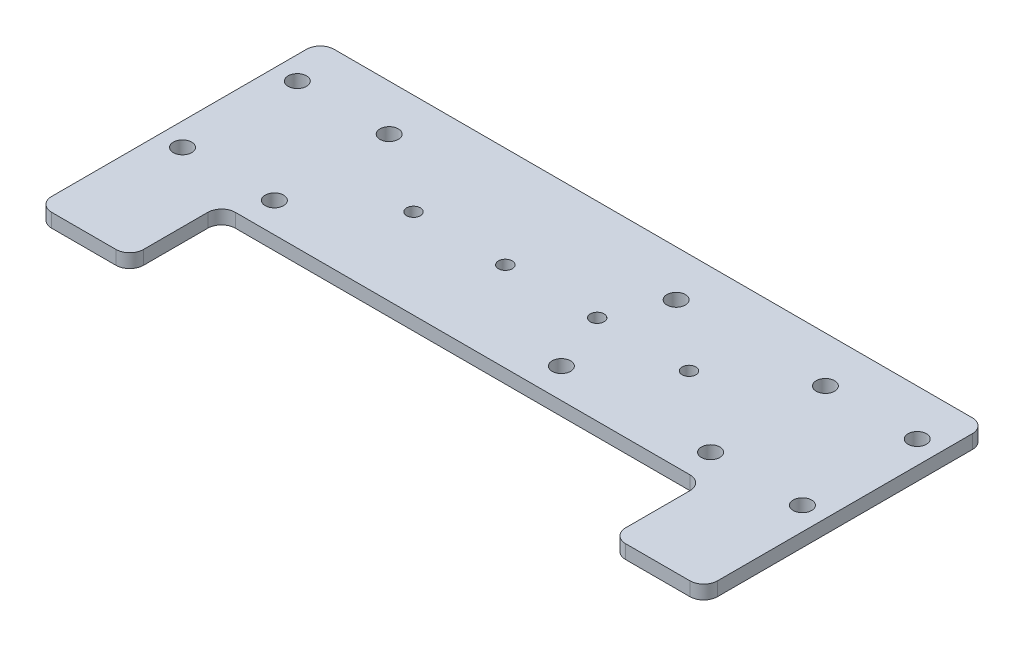
ISO-10303-21;
HEADER;
FILE_DESCRIPTION(('STEP AP214'),'2;1');
FILE_NAME('part.step','',(''),(''),'','','');
FILE_SCHEMA(('AUTOMOTIVE_DESIGN { 1 0 10303 214 1 1 1 1 }'));
ENDSEC;
DATA;
#1=APPLICATION_CONTEXT('core data for automotive mechanical design processes');
#2=APPLICATION_PROTOCOL_DEFINITION('international standard','automotive_design',2000,#1);
#3=PRODUCT_CONTEXT('',#1,'mechanical');
#4=PRODUCT('Part','Part','',(#3));
#5=PRODUCT_RELATED_PRODUCT_CATEGORY('part','',(#4));
#6=PRODUCT_DEFINITION_FORMATION('','',#4);
#7=PRODUCT_DEFINITION_CONTEXT('part definition',#1,'design');
#8=PRODUCT_DEFINITION('design','',#6,#7);
#9=PRODUCT_DEFINITION_SHAPE('','',#8);
#10=(LENGTH_UNIT() NAMED_UNIT(*) SI_UNIT(.MILLI.,.METRE.));
#11=(NAMED_UNIT(*) PLANE_ANGLE_UNIT() SI_UNIT($,.RADIAN.));
#12=(NAMED_UNIT(*) SI_UNIT($,.STERADIAN.) SOLID_ANGLE_UNIT());
#13=UNCERTAINTY_MEASURE_WITH_UNIT(LENGTH_MEASURE(1.E-05),#10,'distance_accuracy_value','');
#14=(GEOMETRIC_REPRESENTATION_CONTEXT(3) GLOBAL_UNCERTAINTY_ASSIGNED_CONTEXT((#13)) GLOBAL_UNIT_ASSIGNED_CONTEXT((#10,
#11,#12)) REPRESENTATION_CONTEXT('',''));
#15=CARTESIAN_POINT('',(0.,0.,0.));
#16=DIRECTION('',(0.,0.,1.));
#17=DIRECTION('',(1.,0.,0.));
#18=AXIS2_PLACEMENT_3D('',#15,#16,#17);
#19=CARTESIAN_POINT('',(72.5,3.,39.));
#20=DIRECTION('',(0.,0.,-1.));
#21=DIRECTION('',(-1.,0.,0.));
#22=AXIS2_PLACEMENT_3D('',#19,#20,#21);
#23=PLANE('',#22);
#24=DIRECTION('',(1.,0.,0.));
#25=VECTOR('',#24,1.);
#26=CARTESIAN_POINT('',(72.5,0.,39.));
#27=LINE('',#26,#25);
#28=CARTESIAN_POINT('',(-69.5,0.,39.));
#29=VERTEX_POINT('',#28);
#30=CARTESIAN_POINT('',(-55.5,0.,39.));
#31=VERTEX_POINT('',#30);
#32=EDGE_CURVE('E168',#29,#31,#27,.T.);
#33=ORIENTED_EDGE('',*,*,#32,.T.);
#34=DIRECTION('',(0.,1.,0.));
#35=VECTOR('',#34,1.);
#36=CARTESIAN_POINT('',(-55.5,3.,39.));
#37=LINE('',#36,#35);
#38=CARTESIAN_POINT('',(-55.5,3.,39.));
#39=VERTEX_POINT('',#38);
#40=EDGE_CURVE('E244',#31,#39,#37,.T.);
#41=ORIENTED_EDGE('',*,*,#40,.T.);
#42=DIRECTION('',(1.,0.,0.));
#43=VECTOR('',#42,1.);
#44=CARTESIAN_POINT('',(72.5,3.,39.));
#45=LINE('',#44,#43);
#46=CARTESIAN_POINT('',(-69.5,3.,39.));
#47=VERTEX_POINT('',#46);
#48=EDGE_CURVE('E169',#47,#39,#45,.T.);
#49=ORIENTED_EDGE('',*,*,#48,.F.);
#50=DIRECTION('',(0.,-1.,0.));
#51=VECTOR('',#50,1.);
#52=CARTESIAN_POINT('',(-69.5,3.,39.));
#53=LINE('',#52,#51);
#54=EDGE_CURVE('E156',#47,#29,#53,.T.);
#55=ORIENTED_EDGE('',*,*,#54,.T.);
#56=EDGE_LOOP('',(#33,#41,#49,#55));
#57=FACE_BOUND('',#56,.T.);
#58=ADVANCED_FACE('F39',(#57),#23,.F.);
#59=CARTESIAN_POINT('',(0.,3.,0.));
#60=DIRECTION('',(0.,1.,0.));
#61=DIRECTION('',(0.,0.,1.));
#62=AXIS2_PLACEMENT_3D('',#59,#60,#61);
#63=PLANE('',#62);
#64=CARTESIAN_POINT('',(-30.2,3.,-0.499999999999987));
#65=DIRECTION('',(0.,1.,0.));
#66=DIRECTION('',(0.,0.,1.));
#67=AXIS2_PLACEMENT_3D('',#64,#65,#66);
#68=CIRCLE('',#67,1.5);
#69=CARTESIAN_POINT('',(-30.2,3.,1.00000000000002));
#70=VERTEX_POINT('',#69);
#71=EDGE_CURVE('E389',#70,#70,#68,.T.);
#72=ORIENTED_EDGE('',*,*,#71,.F.);
#73=EDGE_LOOP('',(#72));
#74=FACE_BOUND('',#73,.T.);
#75=CARTESIAN_POINT('',(-10.2,3.,-0.499999999999987));
#76=DIRECTION('',(0.,1.,0.));
#77=DIRECTION('',(0.,0.,1.));
#78=AXIS2_PLACEMENT_3D('',#75,#76,#77);
#79=CIRCLE('',#78,1.5);
#80=CARTESIAN_POINT('',(-10.2,3.,1.00000000000002));
#81=VERTEX_POINT('',#80);
#82=EDGE_CURVE('E765',#81,#81,#79,.T.);
#83=ORIENTED_EDGE('',*,*,#82,.F.);
#84=EDGE_LOOP('',(#83));
#85=FACE_BOUND('',#84,.T.);
#86=CARTESIAN_POINT('',(9.8,3.,-0.499999999999987));
#87=DIRECTION('',(0.,1.,0.));
#88=DIRECTION('',(0.,0.,1.));
#89=AXIS2_PLACEMENT_3D('',#86,#87,#88);
#90=CIRCLE('',#89,1.5);
#91=CARTESIAN_POINT('',(9.8,3.,1.00000000000002));
#92=VERTEX_POINT('',#91);
#93=EDGE_CURVE('E759',#92,#92,#90,.T.);
#94=ORIENTED_EDGE('',*,*,#93,.F.);
#95=EDGE_LOOP('',(#94));
#96=FACE_BOUND('',#95,.T.);
#97=CARTESIAN_POINT('',(29.8,3.,-0.499999999999987));
#98=DIRECTION('',(0.,1.,0.));
#99=DIRECTION('',(0.,0.,1.));
#100=AXIS2_PLACEMENT_3D('',#97,#98,#99);
#101=CIRCLE('',#100,1.5);
#102=CARTESIAN_POINT('',(29.8,3.,1.00000000000002));
#103=VERTEX_POINT('',#102);
#104=EDGE_CURVE('E755',#103,#103,#101,.T.);
#105=ORIENTED_EDGE('',*,*,#104,.F.);
#106=EDGE_LOOP('',(#105));
#107=FACE_BOUND('',#106,.T.);
#108=DIRECTION('',(0.,0.,-1.));
#109=VECTOR('',#108,1.);
#110=CARTESIAN_POINT('',(52.5,3.,19.));
#111=LINE('',#110,#109);
#112=CARTESIAN_POINT('',(52.5,3.,36.));
#113=VERTEX_POINT('',#112);
#114=CARTESIAN_POINT('',(52.5,3.,22.));
#115=VERTEX_POINT('',#114);
#116=EDGE_CURVE('E263',#113,#115,#111,.T.);
#117=ORIENTED_EDGE('',*,*,#116,.F.);
#118=CARTESIAN_POINT('',(55.5,3.,36.));
#119=DIRECTION('',(0.,1.,0.));
#120=DIRECTION('',(0.,0.,1.));
#121=AXIS2_PLACEMENT_3D('',#118,#119,#120);
#122=CIRCLE('',#121,3.);
#123=CARTESIAN_POINT('',(55.5,3.,39.));
#124=VERTEX_POINT('',#123);
#125=EDGE_CURVE('E237',#113,#124,#122,.T.);
#126=ORIENTED_EDGE('',*,*,#125,.T.);
#127=CARTESIAN_POINT('',(69.5,3.,39.));
#128=VERTEX_POINT('',#127);
#129=EDGE_CURVE('E343',#124,#128,#45,.T.);
#130=ORIENTED_EDGE('',*,*,#129,.T.);
#131=CARTESIAN_POINT('',(69.5,3.,36.));
#132=DIRECTION('',(0.,1.,0.));
#133=DIRECTION('',(0.,0.,1.));
#134=AXIS2_PLACEMENT_3D('',#131,#132,#133);
#135=CIRCLE('',#134,3.);
#136=CARTESIAN_POINT('',(72.5,3.,36.));
#137=VERTEX_POINT('',#136);
#138=EDGE_CURVE('E200',#128,#137,#135,.T.);
#139=ORIENTED_EDGE('',*,*,#138,.T.);
#140=DIRECTION('',(0.,0.,-1.));
#141=VECTOR('',#140,1.);
#142=CARTESIAN_POINT('',(72.5,3.,-22.5));
#143=LINE('',#142,#141);
#144=CARTESIAN_POINT('',(72.5,3.,-19.5));
#145=VERTEX_POINT('',#144);
#146=EDGE_CURVE('E190',#137,#145,#143,.T.);
#147=ORIENTED_EDGE('',*,*,#146,.T.);
#148=CARTESIAN_POINT('',(69.5,3.,-19.5));
#149=DIRECTION('',(0.,1.,0.));
#150=DIRECTION('',(0.,0.,1.));
#151=AXIS2_PLACEMENT_3D('',#148,#149,#150);
#152=CIRCLE('',#151,3.);
#153=CARTESIAN_POINT('',(69.5,3.,-22.5));
#154=VERTEX_POINT('',#153);
#155=EDGE_CURVE('E202',#145,#154,#152,.T.);
#156=ORIENTED_EDGE('',*,*,#155,.T.);
#157=DIRECTION('',(-1.,0.,0.));
#158=VECTOR('',#157,1.);
#159=CARTESIAN_POINT('',(72.5,3.,-22.5));
#160=LINE('',#159,#158);
#161=CARTESIAN_POINT('',(-69.5,3.,-22.5));
#162=VERTEX_POINT('',#161);
#163=EDGE_CURVE('E183',#154,#162,#160,.T.);
#164=ORIENTED_EDGE('',*,*,#163,.T.);
#165=CARTESIAN_POINT('',(-69.5,3.,-19.5));
#166=DIRECTION('',(0.,1.,0.));
#167=DIRECTION('',(0.,0.,1.));
#168=AXIS2_PLACEMENT_3D('',#165,#166,#167);
#169=CIRCLE('',#168,3.);
#170=CARTESIAN_POINT('',(-72.5,3.,-19.5));
#171=VERTEX_POINT('',#170);
#172=EDGE_CURVE('E204',#162,#171,#169,.T.);
#173=ORIENTED_EDGE('',*,*,#172,.T.);
#174=DIRECTION('',(0.,0.,1.));
#175=VECTOR('',#174,1.);
#176=CARTESIAN_POINT('',(-72.5,3.,-22.5));
#177=LINE('',#176,#175);
#178=CARTESIAN_POINT('',(-72.5,3.,36.));
#179=VERTEX_POINT('',#178);
#180=EDGE_CURVE('E340',#171,#179,#177,.T.);
#181=ORIENTED_EDGE('',*,*,#180,.T.);
#182=CARTESIAN_POINT('',(-69.5,3.,36.));
#183=DIRECTION('',(0.,1.,0.));
#184=DIRECTION('',(0.,0.,1.));
#185=AXIS2_PLACEMENT_3D('',#182,#183,#184);
#186=CIRCLE('',#185,3.);
#187=EDGE_CURVE('E206',#179,#47,#186,.T.);
#188=ORIENTED_EDGE('',*,*,#187,.T.);
#189=ORIENTED_EDGE('',*,*,#48,.T.);
#190=CARTESIAN_POINT('',(-55.5,3.,36.));
#191=DIRECTION('',(0.,1.,0.));
#192=DIRECTION('',(0.,0.,1.));
#193=AXIS2_PLACEMENT_3D('',#190,#191,#192);
#194=CIRCLE('',#193,3.);
#195=CARTESIAN_POINT('',(-52.5,3.,36.));
#196=VERTEX_POINT('',#195);
#197=EDGE_CURVE('E54',#39,#196,#194,.T.);
#198=ORIENTED_EDGE('',*,*,#197,.T.);
#199=DIRECTION('',(0.,0.,1.));
#200=VECTOR('',#199,1.);
#201=CARTESIAN_POINT('',(-52.5,3.,39.));
#202=LINE('',#201,#200);
#203=CARTESIAN_POINT('',(-52.5,3.,22.));
#204=VERTEX_POINT('',#203);
#205=EDGE_CURVE('E255',#204,#196,#202,.T.);
#206=ORIENTED_EDGE('',*,*,#205,.F.);
#207=CARTESIAN_POINT('',(-49.5,3.,22.));
#208=DIRECTION('',(0.,1.,0.));
#209=DIRECTION('',(0.,0.,1.));
#210=AXIS2_PLACEMENT_3D('',#207,#208,#209);
#211=CIRCLE('',#210,3.);
#212=CARTESIAN_POINT('',(-49.5,3.,19.));
#213=VERTEX_POINT('',#212);
#214=EDGE_CURVE('E47',#204,#213,#211,.F.);
#215=ORIENTED_EDGE('',*,*,#214,.T.);
#216=DIRECTION('',(-1.,0.,0.));
#217=VECTOR('',#216,1.);
#218=CARTESIAN_POINT('',(-52.5,3.,19.));
#219=LINE('',#218,#217);
#220=CARTESIAN_POINT('',(49.5,3.,19.));
#221=VERTEX_POINT('',#220);
#222=EDGE_CURVE('E254',#221,#213,#219,.T.);
#223=ORIENTED_EDGE('',*,*,#222,.F.);
#224=CARTESIAN_POINT('',(49.5,3.,22.));
#225=DIRECTION('',(0.,1.,0.));
#226=DIRECTION('',(0.,0.,1.));
#227=AXIS2_PLACEMENT_3D('',#224,#225,#226);
#228=CIRCLE('',#227,3.);
#229=EDGE_CURVE('E246',#221,#115,#228,.F.);
#230=ORIENTED_EDGE('',*,*,#229,.T.);
#231=EDGE_LOOP('',(#117,#126,#130,#139,#147,#156,#164,#173,#181,#188,#189,#198,#206,#215,#223,#230));
#232=FACE_BOUND('',#231,.T.);
#233=CARTESIAN_POINT('',(47.5,3.,-12.5));
#234=DIRECTION('',(0.,1.,0.));
#235=DIRECTION('',(0.,0.,1.));
#236=AXIS2_PLACEMENT_3D('',#233,#234,#235);
#237=CIRCLE('',#236,2.);
#238=CARTESIAN_POINT('',(47.5,3.,-10.5));
#239=VERTEX_POINT('',#238);
#240=EDGE_CURVE('E284',#239,#239,#237,.T.);
#241=ORIENTED_EDGE('',*,*,#240,.F.);
#242=EDGE_LOOP('',(#241));
#243=FACE_BOUND('',#242,.T.);
#244=CARTESIAN_POINT('',(-47.5,3.,-12.5));
#245=DIRECTION('',(0.,1.,0.));
#246=DIRECTION('',(0.,0.,1.));
#247=AXIS2_PLACEMENT_3D('',#244,#245,#246);
#248=CIRCLE('',#247,2.);
#249=CARTESIAN_POINT('',(-47.5,3.,-10.5));
#250=VERTEX_POINT('',#249);
#251=EDGE_CURVE('E296',#250,#250,#248,.T.);
#252=ORIENTED_EDGE('',*,*,#251,.F.);
#253=EDGE_LOOP('',(#252));
#254=FACE_BOUND('',#253,.T.);
#255=CARTESIAN_POINT('',(15.,3.,-12.5));
#256=DIRECTION('',(0.,1.,0.));
#257=DIRECTION('',(0.,0.,1.));
#258=AXIS2_PLACEMENT_3D('',#255,#256,#257);
#259=CIRCLE('',#258,2.);
#260=CARTESIAN_POINT('',(15.,3.,-10.5));
#261=VERTEX_POINT('',#260);
#262=EDGE_CURVE('E308',#261,#261,#259,.T.);
#263=ORIENTED_EDGE('',*,*,#262,.F.);
#264=EDGE_LOOP('',(#263));
#265=FACE_BOUND('',#264,.T.);
#266=CARTESIAN_POINT('',(67.5,3.,-12.5));
#267=DIRECTION('',(0.,1.,0.));
#268=DIRECTION('',(0.,0.,1.));
#269=AXIS2_PLACEMENT_3D('',#266,#267,#268);
#270=CIRCLE('',#269,2.);
#271=CARTESIAN_POINT('',(67.5,3.,-10.5));
#272=VERTEX_POINT('',#271);
#273=EDGE_CURVE('E320',#272,#272,#270,.T.);
#274=ORIENTED_EDGE('',*,*,#273,.F.);
#275=EDGE_LOOP('',(#274));
#276=FACE_BOUND('',#275,.T.);
#277=CARTESIAN_POINT('',(-67.5,3.,-12.5));
#278=DIRECTION('',(0.,1.,0.));
#279=DIRECTION('',(0.,0.,1.));
#280=AXIS2_PLACEMENT_3D('',#277,#278,#279);
#281=CIRCLE('',#280,2.);
#282=CARTESIAN_POINT('',(-67.5,3.,-10.5));
#283=VERTEX_POINT('',#282);
#284=EDGE_CURVE('E332',#283,#283,#281,.T.);
#285=ORIENTED_EDGE('',*,*,#284,.F.);
#286=EDGE_LOOP('',(#285));
#287=FACE_BOUND('',#286,.T.);
#288=CARTESIAN_POINT('',(-67.5,3.,12.5));
#289=DIRECTION('',(0.,1.,0.));
#290=DIRECTION('',(0.,0.,1.));
#291=AXIS2_PLACEMENT_3D('',#288,#289,#290);
#292=CIRCLE('',#291,2.);
#293=CARTESIAN_POINT('',(-67.5,3.,14.5));
#294=VERTEX_POINT('',#293);
#295=EDGE_CURVE('E326',#294,#294,#292,.T.);
#296=ORIENTED_EDGE('',*,*,#295,.F.);
#297=EDGE_LOOP('',(#296));
#298=FACE_BOUND('',#297,.T.);
#299=CARTESIAN_POINT('',(67.5,3.,12.5));
#300=DIRECTION('',(0.,1.,0.));
#301=DIRECTION('',(0.,0.,1.));
#302=AXIS2_PLACEMENT_3D('',#299,#300,#301);
#303=CIRCLE('',#302,2.);
#304=CARTESIAN_POINT('',(67.5,3.,14.5));
#305=VERTEX_POINT('',#304);
#306=EDGE_CURVE('E314',#305,#305,#303,.T.);
#307=ORIENTED_EDGE('',*,*,#306,.F.);
#308=EDGE_LOOP('',(#307));
#309=FACE_BOUND('',#308,.T.);
#310=CARTESIAN_POINT('',(15.,3.,12.5));
#311=DIRECTION('',(0.,1.,0.));
#312=DIRECTION('',(0.,0.,1.));
#313=AXIS2_PLACEMENT_3D('',#310,#311,#312);
#314=CIRCLE('',#313,2.);
#315=CARTESIAN_POINT('',(15.,3.,14.5));
#316=VERTEX_POINT('',#315);
#317=EDGE_CURVE('E302',#316,#316,#314,.T.);
#318=ORIENTED_EDGE('',*,*,#317,.F.);
#319=EDGE_LOOP('',(#318));
#320=FACE_BOUND('',#319,.T.);
#321=CARTESIAN_POINT('',(-47.5,3.,12.5));
#322=DIRECTION('',(0.,1.,0.));
#323=DIRECTION('',(0.,0.,1.));
#324=AXIS2_PLACEMENT_3D('',#321,#322,#323);
#325=CIRCLE('',#324,2.);
#326=CARTESIAN_POINT('',(-47.5,3.,14.5));
#327=VERTEX_POINT('',#326);
#328=EDGE_CURVE('E290',#327,#327,#325,.T.);
#329=ORIENTED_EDGE('',*,*,#328,.F.);
#330=EDGE_LOOP('',(#329));
#331=FACE_BOUND('',#330,.T.);
#332=CARTESIAN_POINT('',(47.5,3.,12.5));
#333=DIRECTION('',(0.,1.,0.));
#334=DIRECTION('',(0.,0.,1.));
#335=AXIS2_PLACEMENT_3D('',#332,#333,#334);
#336=CIRCLE('',#335,2.);
#337=CARTESIAN_POINT('',(47.5,3.,14.5));
#338=VERTEX_POINT('',#337);
#339=EDGE_CURVE('E275',#338,#338,#336,.T.);
#340=ORIENTED_EDGE('',*,*,#339,.F.);
#341=EDGE_LOOP('',(#340));
#342=FACE_BOUND('',#341,.T.);
#343=ADVANCED_FACE('F252',(#74,#85,#96,#107,#232,#243,#254,#265,#276,#287,#298,#309,#320,#331,
#342),#63,.T.);
#344=CARTESIAN_POINT('',(0.,0.,0.));
#345=DIRECTION('',(0.,1.,0.));
#346=DIRECTION('',(0.,0.,1.));
#347=AXIS2_PLACEMENT_3D('',#344,#345,#346);
#348=PLANE('',#347);
#349=CARTESIAN_POINT('',(-30.2,0.,-0.499999999999987));
#350=DIRECTION('',(0.,1.,0.));
#351=DIRECTION('',(0.,0.,1.));
#352=AXIS2_PLACEMENT_3D('',#349,#350,#351);
#353=CIRCLE('',#352,1.5);
#354=CARTESIAN_POINT('',(-30.2,0.,1.00000000000002));
#355=VERTEX_POINT('',#354);
#356=EDGE_CURVE('E386',#355,#355,#353,.T.);
#357=ORIENTED_EDGE('',*,*,#356,.T.);
#358=EDGE_LOOP('',(#357));
#359=FACE_BOUND('',#358,.T.);
#360=CARTESIAN_POINT('',(-10.2,0.,-0.499999999999987));
#361=DIRECTION('',(0.,1.,0.));
#362=DIRECTION('',(0.,0.,1.));
#363=AXIS2_PLACEMENT_3D('',#360,#361,#362);
#364=CIRCLE('',#363,1.5);
#365=CARTESIAN_POINT('',(-10.2,0.,1.00000000000002));
#366=VERTEX_POINT('',#365);
#367=EDGE_CURVE('E748',#366,#366,#364,.T.);
#368=ORIENTED_EDGE('',*,*,#367,.T.);
#369=EDGE_LOOP('',(#368));
#370=FACE_BOUND('',#369,.T.);
#371=CARTESIAN_POINT('',(9.8,0.,-0.499999999999987));
#372=DIRECTION('',(0.,1.,0.));
#373=DIRECTION('',(0.,0.,1.));
#374=AXIS2_PLACEMENT_3D('',#371,#372,#373);
#375=CIRCLE('',#374,1.5);
#376=CARTESIAN_POINT('',(9.8,0.,1.00000000000002));
#377=VERTEX_POINT('',#376);
#378=EDGE_CURVE('E752',#377,#377,#375,.T.);
#379=ORIENTED_EDGE('',*,*,#378,.T.);
#380=EDGE_LOOP('',(#379));
#381=FACE_BOUND('',#380,.T.);
#382=CARTESIAN_POINT('',(29.8,0.,-0.499999999999987));
#383=DIRECTION('',(0.,1.,0.));
#384=DIRECTION('',(0.,0.,1.));
#385=AXIS2_PLACEMENT_3D('',#382,#383,#384);
#386=CIRCLE('',#385,1.5);
#387=CARTESIAN_POINT('',(29.8,0.,1.00000000000002));
#388=VERTEX_POINT('',#387);
#389=EDGE_CURVE('E392',#388,#388,#386,.T.);
#390=ORIENTED_EDGE('',*,*,#389,.T.);
#391=EDGE_LOOP('',(#390));
#392=FACE_BOUND('',#391,.T.);
#393=CARTESIAN_POINT('',(55.5,0.,39.));
#394=VERTEX_POINT('',#393);
#395=CARTESIAN_POINT('',(69.5,0.,39.));
#396=VERTEX_POINT('',#395);
#397=EDGE_CURVE('E180',#394,#396,#27,.T.);
#398=ORIENTED_EDGE('',*,*,#397,.F.);
#399=CARTESIAN_POINT('',(55.5,0.,36.));
#400=DIRECTION('',(0.,1.,0.));
#401=DIRECTION('',(0.,0.,1.));
#402=AXIS2_PLACEMENT_3D('',#399,#400,#401);
#403=CIRCLE('',#402,3.);
#404=CARTESIAN_POINT('',(52.5,0.,36.));
#405=VERTEX_POINT('',#404);
#406=EDGE_CURVE('E234',#394,#405,#403,.F.);
#407=ORIENTED_EDGE('',*,*,#406,.T.);
#408=DIRECTION('',(0.,0.,-1.));
#409=VECTOR('',#408,1.);
#410=CARTESIAN_POINT('',(52.5,0.,0.));
#411=LINE('',#410,#409);
#412=CARTESIAN_POINT('',(52.5,0.,22.));
#413=VERTEX_POINT('',#412);
#414=EDGE_CURVE('E272',#405,#413,#411,.T.);
#415=ORIENTED_EDGE('',*,*,#414,.T.);
#416=CARTESIAN_POINT('',(49.5,0.,22.));
#417=DIRECTION('',(0.,1.,0.));
#418=DIRECTION('',(0.,0.,1.));
#419=AXIS2_PLACEMENT_3D('',#416,#417,#418);
#420=CIRCLE('',#419,3.);
#421=CARTESIAN_POINT('',(49.5,0.,19.));
#422=VERTEX_POINT('',#421);
#423=EDGE_CURVE('E248',#413,#422,#420,.T.);
#424=ORIENTED_EDGE('',*,*,#423,.T.);
#425=DIRECTION('',(-1.,0.,0.));
#426=VECTOR('',#425,1.);
#427=CARTESIAN_POINT('',(0.,0.,19.));
#428=LINE('',#427,#426);
#429=CARTESIAN_POINT('',(-49.5,0.,19.));
#430=VERTEX_POINT('',#429);
#431=EDGE_CURVE('E218',#422,#430,#428,.T.);
#432=ORIENTED_EDGE('',*,*,#431,.T.);
#433=CARTESIAN_POINT('',(-49.5,0.,22.));
#434=DIRECTION('',(0.,1.,0.));
#435=DIRECTION('',(0.,0.,1.));
#436=AXIS2_PLACEMENT_3D('',#433,#434,#435);
#437=CIRCLE('',#436,3.);
#438=CARTESIAN_POINT('',(-52.5,0.,22.));
#439=VERTEX_POINT('',#438);
#440=EDGE_CURVE('E11',#430,#439,#437,.T.);
#441=ORIENTED_EDGE('',*,*,#440,.T.);
#442=DIRECTION('',(0.,0.,1.));
#443=VECTOR('',#442,1.);
#444=CARTESIAN_POINT('',(-52.5,0.,0.));
#445=LINE('',#444,#443);
#446=CARTESIAN_POINT('',(-52.5,0.,36.));
#447=VERTEX_POINT('',#446);
#448=EDGE_CURVE('E268',#439,#447,#445,.T.);
#449=ORIENTED_EDGE('',*,*,#448,.T.);
#450=CARTESIAN_POINT('',(-55.5,0.,36.));
#451=DIRECTION('',(0.,1.,0.));
#452=DIRECTION('',(0.,0.,1.));
#453=AXIS2_PLACEMENT_3D('',#450,#451,#452);
#454=CIRCLE('',#453,3.);
#455=EDGE_CURVE('E178',#447,#31,#454,.F.);
#456=ORIENTED_EDGE('',*,*,#455,.T.);
#457=ORIENTED_EDGE('',*,*,#32,.F.);
#458=CARTESIAN_POINT('',(-69.5,0.,36.));
#459=DIRECTION('',(0.,1.,0.));
#460=DIRECTION('',(0.,0.,1.));
#461=AXIS2_PLACEMENT_3D('',#458,#459,#460);
#462=CIRCLE('',#461,3.);
#463=CARTESIAN_POINT('',(-72.5,0.,36.));
#464=VERTEX_POINT('',#463);
#465=EDGE_CURVE('E152',#29,#464,#462,.F.);
#466=ORIENTED_EDGE('',*,*,#465,.T.);
#467=DIRECTION('',(0.,0.,1.));
#468=VECTOR('',#467,1.);
#469=CARTESIAN_POINT('',(-72.5,0.,-22.5));
#470=LINE('',#469,#468);
#471=CARTESIAN_POINT('',(-72.5,0.,-19.5));
#472=VERTEX_POINT('',#471);
#473=EDGE_CURVE('E185',#472,#464,#470,.T.);
#474=ORIENTED_EDGE('',*,*,#473,.F.);
#475=CARTESIAN_POINT('',(-69.5,0.,-19.5));
#476=DIRECTION('',(0.,1.,0.));
#477=DIRECTION('',(0.,0.,1.));
#478=AXIS2_PLACEMENT_3D('',#475,#476,#477);
#479=CIRCLE('',#478,3.);
#480=CARTESIAN_POINT('',(-69.5,0.,-22.5));
#481=VERTEX_POINT('',#480);
#482=EDGE_CURVE('E163',#472,#481,#479,.F.);
#483=ORIENTED_EDGE('',*,*,#482,.T.);
#484=DIRECTION('',(-1.,0.,0.));
#485=VECTOR('',#484,1.);
#486=CARTESIAN_POINT('',(72.5,0.,-22.5));
#487=LINE('',#486,#485);
#488=CARTESIAN_POINT('',(69.5,0.,-22.5));
#489=VERTEX_POINT('',#488);
#490=EDGE_CURVE('E335',#489,#481,#487,.T.);
#491=ORIENTED_EDGE('',*,*,#490,.F.);
#492=CARTESIAN_POINT('',(69.5,0.,-19.5));
#493=DIRECTION('',(0.,1.,0.));
#494=DIRECTION('',(0.,0.,1.));
#495=AXIS2_PLACEMENT_3D('',#492,#493,#494);
#496=CIRCLE('',#495,3.);
#497=CARTESIAN_POINT('',(72.5,0.,-19.5));
#498=VERTEX_POINT('',#497);
#499=EDGE_CURVE('E194',#489,#498,#496,.F.);
#500=ORIENTED_EDGE('',*,*,#499,.T.);
#501=DIRECTION('',(0.,0.,-1.));
#502=VECTOR('',#501,1.);
#503=CARTESIAN_POINT('',(72.5,0.,-22.5));
#504=LINE('',#503,#502);
#505=CARTESIAN_POINT('',(72.5,0.,36.));
#506=VERTEX_POINT('',#505);
#507=EDGE_CURVE('E179',#506,#498,#504,.T.);
#508=ORIENTED_EDGE('',*,*,#507,.F.);
#509=CARTESIAN_POINT('',(69.5,0.,36.));
#510=DIRECTION('',(0.,1.,0.));
#511=DIRECTION('',(0.,0.,1.));
#512=AXIS2_PLACEMENT_3D('',#509,#510,#511);
#513=CIRCLE('',#512,3.);
#514=EDGE_CURVE('E170',#506,#396,#513,.F.);
#515=ORIENTED_EDGE('',*,*,#514,.T.);
#516=EDGE_LOOP('',(#398,#407,#415,#424,#432,#441,#449,#456,#457,#466,#474,#483,#491,#500,#508,#515));
#517=FACE_BOUND('',#516,.T.);
#518=CARTESIAN_POINT('',(-67.5,0.,-12.5));
#519=DIRECTION('',(0.,1.,0.));
#520=DIRECTION('',(0.,0.,1.));
#521=AXIS2_PLACEMENT_3D('',#518,#519,#520);
#522=CIRCLE('',#521,2.);
#523=CARTESIAN_POINT('',(-67.5,0.,-10.5));
#524=VERTEX_POINT('',#523);
#525=EDGE_CURVE('E329',#524,#524,#522,.T.);
#526=ORIENTED_EDGE('',*,*,#525,.T.);
#527=EDGE_LOOP('',(#526));
#528=FACE_BOUND('',#527,.T.);
#529=CARTESIAN_POINT('',(-67.5,0.,12.5));
#530=DIRECTION('',(0.,1.,0.));
#531=DIRECTION('',(0.,0.,1.));
#532=AXIS2_PLACEMENT_3D('',#529,#530,#531);
#533=CIRCLE('',#532,2.);
#534=CARTESIAN_POINT('',(-67.5,0.,14.5));
#535=VERTEX_POINT('',#534);
#536=EDGE_CURVE('E323',#535,#535,#533,.T.);
#537=ORIENTED_EDGE('',*,*,#536,.T.);
#538=EDGE_LOOP('',(#537));
#539=FACE_BOUND('',#538,.T.);
#540=CARTESIAN_POINT('',(67.5,0.,-12.5));
#541=DIRECTION('',(0.,1.,0.));
#542=DIRECTION('',(0.,0.,1.));
#543=AXIS2_PLACEMENT_3D('',#540,#541,#542);
#544=CIRCLE('',#543,2.);
#545=CARTESIAN_POINT('',(67.5,0.,-10.5));
#546=VERTEX_POINT('',#545);
#547=EDGE_CURVE('E317',#546,#546,#544,.T.);
#548=ORIENTED_EDGE('',*,*,#547,.T.);
#549=EDGE_LOOP('',(#548));
#550=FACE_BOUND('',#549,.T.);
#551=CARTESIAN_POINT('',(67.5,0.,12.5));
#552=DIRECTION('',(0.,1.,0.));
#553=DIRECTION('',(0.,0.,1.));
#554=AXIS2_PLACEMENT_3D('',#551,#552,#553);
#555=CIRCLE('',#554,2.);
#556=CARTESIAN_POINT('',(67.5,0.,14.5));
#557=VERTEX_POINT('',#556);
#558=EDGE_CURVE('E311',#557,#557,#555,.T.);
#559=ORIENTED_EDGE('',*,*,#558,.T.);
#560=EDGE_LOOP('',(#559));
#561=FACE_BOUND('',#560,.T.);
#562=CARTESIAN_POINT('',(15.,0.,-12.5));
#563=DIRECTION('',(0.,1.,0.));
#564=DIRECTION('',(0.,0.,1.));
#565=AXIS2_PLACEMENT_3D('',#562,#563,#564);
#566=CIRCLE('',#565,2.);
#567=CARTESIAN_POINT('',(15.,0.,-10.5));
#568=VERTEX_POINT('',#567);
#569=EDGE_CURVE('E305',#568,#568,#566,.T.);
#570=ORIENTED_EDGE('',*,*,#569,.T.);
#571=EDGE_LOOP('',(#570));
#572=FACE_BOUND('',#571,.T.);
#573=CARTESIAN_POINT('',(15.,0.,12.5));
#574=DIRECTION('',(0.,1.,0.));
#575=DIRECTION('',(0.,0.,1.));
#576=AXIS2_PLACEMENT_3D('',#573,#574,#575);
#577=CIRCLE('',#576,2.);
#578=CARTESIAN_POINT('',(15.,0.,14.5));
#579=VERTEX_POINT('',#578);
#580=EDGE_CURVE('E299',#579,#579,#577,.T.);
#581=ORIENTED_EDGE('',*,*,#580,.T.);
#582=EDGE_LOOP('',(#581));
#583=FACE_BOUND('',#582,.T.);
#584=CARTESIAN_POINT('',(-47.5,0.,-12.5));
#585=DIRECTION('',(0.,1.,0.));
#586=DIRECTION('',(0.,0.,1.));
#587=AXIS2_PLACEMENT_3D('',#584,#585,#586);
#588=CIRCLE('',#587,2.);
#589=CARTESIAN_POINT('',(-47.5,0.,-10.5));
#590=VERTEX_POINT('',#589);
#591=EDGE_CURVE('E293',#590,#590,#588,.T.);
#592=ORIENTED_EDGE('',*,*,#591,.T.);
#593=EDGE_LOOP('',(#592));
#594=FACE_BOUND('',#593,.T.);
#595=CARTESIAN_POINT('',(-47.5,0.,12.5));
#596=DIRECTION('',(0.,1.,0.));
#597=DIRECTION('',(0.,0.,1.));
#598=AXIS2_PLACEMENT_3D('',#595,#596,#597);
#599=CIRCLE('',#598,2.);
#600=CARTESIAN_POINT('',(-47.5,0.,14.5));
#601=VERTEX_POINT('',#600);
#602=EDGE_CURVE('E287',#601,#601,#599,.T.);
#603=ORIENTED_EDGE('',*,*,#602,.T.);
#604=EDGE_LOOP('',(#603));
#605=FACE_BOUND('',#604,.T.);
#606=CARTESIAN_POINT('',(47.5,0.,-12.5));
#607=DIRECTION('',(0.,1.,0.));
#608=DIRECTION('',(0.,0.,1.));
#609=AXIS2_PLACEMENT_3D('',#606,#607,#608);
#610=CIRCLE('',#609,2.);
#611=CARTESIAN_POINT('',(47.5,0.,-10.5));
#612=VERTEX_POINT('',#611);
#613=EDGE_CURVE('E282',#612,#612,#610,.T.);
#614=ORIENTED_EDGE('',*,*,#613,.T.);
#615=EDGE_LOOP('',(#614));
#616=FACE_BOUND('',#615,.T.);
#617=CARTESIAN_POINT('',(47.5,0.,12.5));
#618=DIRECTION('',(0.,1.,0.));
#619=DIRECTION('',(0.,0.,1.));
#620=AXIS2_PLACEMENT_3D('',#617,#618,#619);
#621=CIRCLE('',#620,2.);
#622=CARTESIAN_POINT('',(47.5,0.,14.5));
#623=VERTEX_POINT('',#622);
#624=EDGE_CURVE('E271',#623,#623,#621,.T.);
#625=ORIENTED_EDGE('',*,*,#624,.T.);
#626=EDGE_LOOP('',(#625));
#627=FACE_BOUND('',#626,.T.);
#628=ADVANCED_FACE('F174',(#359,#370,#381,#392,#517,#528,#539,#550,#561,#572,#583,#594,#605,
#616,#627),#348,.F.);
#629=CARTESIAN_POINT('',(72.5,3.,-22.5));
#630=DIRECTION('',(0.,0.,1.));
#631=DIRECTION('',(1.,0.,0.));
#632=AXIS2_PLACEMENT_3D('',#629,#630,#631);
#633=PLANE('',#632);
#634=ORIENTED_EDGE('',*,*,#490,.T.);
#635=DIRECTION('',(0.,-1.,0.));
#636=VECTOR('',#635,1.);
#637=CARTESIAN_POINT('',(-69.5,3.,-22.5));
#638=LINE('',#637,#636);
#639=EDGE_CURVE('E211',#481,#162,#638,.F.);
#640=ORIENTED_EDGE('',*,*,#639,.T.);
#641=ORIENTED_EDGE('',*,*,#163,.F.);
#642=DIRECTION('',(0.,-1.,0.));
#643=VECTOR('',#642,1.);
#644=CARTESIAN_POINT('',(69.5,3.,-22.5));
#645=LINE('',#644,#643);
#646=EDGE_CURVE('E208',#154,#489,#645,.T.);
#647=ORIENTED_EDGE('',*,*,#646,.T.);
#648=EDGE_LOOP('',(#634,#640,#641,#647));
#649=FACE_BOUND('',#648,.T.);
#650=ADVANCED_FACE('F358',(#649),#633,.F.);
#651=CARTESIAN_POINT('',(-72.5,3.,-22.5));
#652=DIRECTION('',(1.,0.,0.));
#653=DIRECTION('',(0.,0.,-1.));
#654=AXIS2_PLACEMENT_3D('',#651,#652,#653);
#655=PLANE('',#654);
#656=ORIENTED_EDGE('',*,*,#473,.T.);
#657=DIRECTION('',(0.,-1.,0.));
#658=VECTOR('',#657,1.);
#659=CARTESIAN_POINT('',(-72.5,3.,36.));
#660=LINE('',#659,#658);
#661=EDGE_CURVE('E157',#464,#179,#660,.F.);
#662=ORIENTED_EDGE('',*,*,#661,.T.);
#663=ORIENTED_EDGE('',*,*,#180,.F.);
#664=DIRECTION('',(0.,-1.,0.));
#665=VECTOR('',#664,1.);
#666=CARTESIAN_POINT('',(-72.5,3.,-19.5));
#667=LINE('',#666,#665);
#668=EDGE_CURVE('E162',#171,#472,#667,.T.);
#669=ORIENTED_EDGE('',*,*,#668,.T.);
#670=EDGE_LOOP('',(#656,#662,#663,#669));
#671=FACE_BOUND('',#670,.T.);
#672=ADVANCED_FACE('F351',(#671),#655,.F.);
#673=ORIENTED_EDGE('',*,*,#129,.F.);
#674=DIRECTION('',(0.,-1.,0.));
#675=VECTOR('',#674,1.);
#676=CARTESIAN_POINT('',(55.5,3.,39.));
#677=LINE('',#676,#675);
#678=EDGE_CURVE('E230',#124,#394,#677,.T.);
#679=ORIENTED_EDGE('',*,*,#678,.T.);
#680=ORIENTED_EDGE('',*,*,#397,.T.);
#681=DIRECTION('',(0.,-1.,0.));
#682=VECTOR('',#681,1.);
#683=CARTESIAN_POINT('',(69.5,3.,39.));
#684=LINE('',#683,#682);
#685=EDGE_CURVE('E171',#396,#128,#684,.F.);
#686=ORIENTED_EDGE('',*,*,#685,.T.);
#687=EDGE_LOOP('',(#673,#679,#680,#686));
#688=FACE_BOUND('',#687,.T.);
#689=ADVANCED_FACE('F376',(#688),#23,.F.);
#690=CARTESIAN_POINT('',(72.5,3.,-22.5));
#691=DIRECTION('',(-1.,0.,0.));
#692=DIRECTION('',(0.,0.,1.));
#693=AXIS2_PLACEMENT_3D('',#690,#691,#692);
#694=PLANE('',#693);
#695=ORIENTED_EDGE('',*,*,#507,.T.);
#696=DIRECTION('',(0.,-1.,0.));
#697=VECTOR('',#696,1.);
#698=CARTESIAN_POINT('',(72.5,3.,-19.5));
#699=LINE('',#698,#697);
#700=EDGE_CURVE('E216',#498,#145,#699,.F.);
#701=ORIENTED_EDGE('',*,*,#700,.T.);
#702=ORIENTED_EDGE('',*,*,#146,.F.);
#703=DIRECTION('',(0.,-1.,0.));
#704=VECTOR('',#703,1.);
#705=CARTESIAN_POINT('',(72.5,3.,36.));
#706=LINE('',#705,#704);
#707=EDGE_CURVE('E213',#137,#506,#706,.T.);
#708=ORIENTED_EDGE('',*,*,#707,.T.);
#709=EDGE_LOOP('',(#695,#701,#702,#708));
#710=FACE_BOUND('',#709,.T.);
#711=ADVANCED_FACE('F367',(#710),#694,.F.);
#712=CARTESIAN_POINT('',(-67.5,3.,-12.5));
#713=DIRECTION('',(0.,-1.,0.));
#714=DIRECTION('',(0.,0.,-1.));
#715=AXIS2_PLACEMENT_3D('',#712,#713,#714);
#716=CYLINDRICAL_SURFACE('',#715,2.);
#717=ORIENTED_EDGE('',*,*,#284,.T.);
#718=EDGE_LOOP('',(#717));
#719=FACE_BOUND('',#718,.T.);
#720=ORIENTED_EDGE('',*,*,#525,.F.);
#721=EDGE_LOOP('',(#720));
#722=FACE_BOUND('',#721,.T.);
#723=ADVANCED_FACE('F412',(#719,#722),#716,.F.);
#724=CARTESIAN_POINT('',(-67.5,3.,12.5));
#725=DIRECTION('',(0.,-1.,0.));
#726=DIRECTION('',(0.,0.,-1.));
#727=AXIS2_PLACEMENT_3D('',#724,#725,#726);
#728=CYLINDRICAL_SURFACE('',#727,2.);
#729=ORIENTED_EDGE('',*,*,#295,.T.);
#730=EDGE_LOOP('',(#729));
#731=FACE_BOUND('',#730,.T.);
#732=ORIENTED_EDGE('',*,*,#536,.F.);
#733=EDGE_LOOP('',(#732));
#734=FACE_BOUND('',#733,.T.);
#735=ADVANCED_FACE('F631',(#731,#734),#728,.F.);
#736=CARTESIAN_POINT('',(67.5,3.,-12.5));
#737=DIRECTION('',(0.,-1.,0.));
#738=DIRECTION('',(0.,0.,-1.));
#739=AXIS2_PLACEMENT_3D('',#736,#737,#738);
#740=CYLINDRICAL_SURFACE('',#739,2.);
#741=ORIENTED_EDGE('',*,*,#273,.T.);
#742=EDGE_LOOP('',(#741));
#743=FACE_BOUND('',#742,.T.);
#744=ORIENTED_EDGE('',*,*,#547,.F.);
#745=EDGE_LOOP('',(#744));
#746=FACE_BOUND('',#745,.T.);
#747=ADVANCED_FACE('F621',(#743,#746),#740,.F.);
#748=CARTESIAN_POINT('',(67.5,3.,12.5));
#749=DIRECTION('',(0.,-1.,0.));
#750=DIRECTION('',(0.,0.,-1.));
#751=AXIS2_PLACEMENT_3D('',#748,#749,#750);
#752=CYLINDRICAL_SURFACE('',#751,2.);
#753=ORIENTED_EDGE('',*,*,#306,.T.);
#754=EDGE_LOOP('',(#753));
#755=FACE_BOUND('',#754,.T.);
#756=ORIENTED_EDGE('',*,*,#558,.F.);
#757=EDGE_LOOP('',(#756));
#758=FACE_BOUND('',#757,.T.);
#759=ADVANCED_FACE('F611',(#755,#758),#752,.F.);
#760=CARTESIAN_POINT('',(15.,3.,-12.5));
#761=DIRECTION('',(0.,-1.,0.));
#762=DIRECTION('',(0.,0.,-1.));
#763=AXIS2_PLACEMENT_3D('',#760,#761,#762);
#764=CYLINDRICAL_SURFACE('',#763,2.);
#765=ORIENTED_EDGE('',*,*,#262,.T.);
#766=EDGE_LOOP('',(#765));
#767=FACE_BOUND('',#766,.T.);
#768=ORIENTED_EDGE('',*,*,#569,.F.);
#769=EDGE_LOOP('',(#768));
#770=FACE_BOUND('',#769,.T.);
#771=ADVANCED_FACE('F601',(#767,#770),#764,.F.);
#772=CARTESIAN_POINT('',(15.,3.,12.5));
#773=DIRECTION('',(0.,-1.,0.));
#774=DIRECTION('',(0.,0.,-1.));
#775=AXIS2_PLACEMENT_3D('',#772,#773,#774);
#776=CYLINDRICAL_SURFACE('',#775,2.);
#777=ORIENTED_EDGE('',*,*,#317,.T.);
#778=EDGE_LOOP('',(#777));
#779=FACE_BOUND('',#778,.T.);
#780=ORIENTED_EDGE('',*,*,#580,.F.);
#781=EDGE_LOOP('',(#780));
#782=FACE_BOUND('',#781,.T.);
#783=ADVANCED_FACE('F591',(#779,#782),#776,.F.);
#784=CARTESIAN_POINT('',(-47.5,3.,-12.5));
#785=DIRECTION('',(0.,-1.,0.));
#786=DIRECTION('',(0.,0.,-1.));
#787=AXIS2_PLACEMENT_3D('',#784,#785,#786);
#788=CYLINDRICAL_SURFACE('',#787,2.);
#789=ORIENTED_EDGE('',*,*,#251,.T.);
#790=EDGE_LOOP('',(#789));
#791=FACE_BOUND('',#790,.T.);
#792=ORIENTED_EDGE('',*,*,#591,.F.);
#793=EDGE_LOOP('',(#792));
#794=FACE_BOUND('',#793,.T.);
#795=ADVANCED_FACE('F581',(#791,#794),#788,.F.);
#796=CARTESIAN_POINT('',(-47.5,3.,12.5));
#797=DIRECTION('',(0.,-1.,0.));
#798=DIRECTION('',(0.,0.,-1.));
#799=AXIS2_PLACEMENT_3D('',#796,#797,#798);
#800=CYLINDRICAL_SURFACE('',#799,2.);
#801=ORIENTED_EDGE('',*,*,#328,.T.);
#802=EDGE_LOOP('',(#801));
#803=FACE_BOUND('',#802,.T.);
#804=ORIENTED_EDGE('',*,*,#602,.F.);
#805=EDGE_LOOP('',(#804));
#806=FACE_BOUND('',#805,.T.);
#807=ADVANCED_FACE('F571',(#803,#806),#800,.F.);
#808=CARTESIAN_POINT('',(47.5,3.,-12.5));
#809=DIRECTION('',(0.,-1.,0.));
#810=DIRECTION('',(0.,0.,-1.));
#811=AXIS2_PLACEMENT_3D('',#808,#809,#810);
#812=CYLINDRICAL_SURFACE('',#811,2.);
#813=ORIENTED_EDGE('',*,*,#240,.T.);
#814=EDGE_LOOP('',(#813));
#815=FACE_BOUND('',#814,.T.);
#816=ORIENTED_EDGE('',*,*,#613,.F.);
#817=EDGE_LOOP('',(#816));
#818=FACE_BOUND('',#817,.T.);
#819=ADVANCED_FACE('F561',(#815,#818),#812,.F.);
#820=CARTESIAN_POINT('',(47.5,3.,12.5));
#821=DIRECTION('',(0.,-1.,0.));
#822=DIRECTION('',(0.,0.,-1.));
#823=AXIS2_PLACEMENT_3D('',#820,#821,#822);
#824=CYLINDRICAL_SURFACE('',#823,2.);
#825=ORIENTED_EDGE('',*,*,#339,.T.);
#826=EDGE_LOOP('',(#825));
#827=FACE_BOUND('',#826,.T.);
#828=ORIENTED_EDGE('',*,*,#624,.F.);
#829=EDGE_LOOP('',(#828));
#830=FACE_BOUND('',#829,.T.);
#831=ADVANCED_FACE('F420',(#827,#830),#824,.F.);
#832=CARTESIAN_POINT('',(-69.5,3.,36.));
#833=DIRECTION('',(0.,-1.,0.));
#834=DIRECTION('',(0.,0.,-1.));
#835=AXIS2_PLACEMENT_3D('',#832,#833,#834);
#836=CYLINDRICAL_SURFACE('',#835,3.);
#837=ORIENTED_EDGE('',*,*,#187,.F.);
#838=ORIENTED_EDGE('',*,*,#661,.F.);
#839=ORIENTED_EDGE('',*,*,#465,.F.);
#840=ORIENTED_EDGE('',*,*,#54,.F.);
#841=EDGE_LOOP('',(#837,#838,#839,#840));
#842=FACE_BOUND('',#841,.T.);
#843=ADVANCED_FACE('F155',(#842),#836,.T.);
#844=CARTESIAN_POINT('',(-69.5,3.,-19.5));
#845=DIRECTION('',(0.,-1.,0.));
#846=DIRECTION('',(0.,0.,-1.));
#847=AXIS2_PLACEMENT_3D('',#844,#845,#846);
#848=CYLINDRICAL_SURFACE('',#847,3.);
#849=ORIENTED_EDGE('',*,*,#172,.F.);
#850=ORIENTED_EDGE('',*,*,#639,.F.);
#851=ORIENTED_EDGE('',*,*,#482,.F.);
#852=ORIENTED_EDGE('',*,*,#668,.F.);
#853=EDGE_LOOP('',(#849,#850,#851,#852));
#854=FACE_BOUND('',#853,.T.);
#855=ADVANCED_FACE('F356',(#854),#848,.T.);
#856=CARTESIAN_POINT('',(69.5,3.,-19.5));
#857=DIRECTION('',(0.,-1.,0.));
#858=DIRECTION('',(0.,0.,-1.));
#859=AXIS2_PLACEMENT_3D('',#856,#857,#858);
#860=CYLINDRICAL_SURFACE('',#859,3.);
#861=ORIENTED_EDGE('',*,*,#155,.F.);
#862=ORIENTED_EDGE('',*,*,#700,.F.);
#863=ORIENTED_EDGE('',*,*,#499,.F.);
#864=ORIENTED_EDGE('',*,*,#646,.F.);
#865=EDGE_LOOP('',(#861,#862,#863,#864));
#866=FACE_BOUND('',#865,.T.);
#867=ADVANCED_FACE('F364',(#866),#860,.T.);
#868=CARTESIAN_POINT('',(69.5,3.,36.));
#869=DIRECTION('',(0.,-1.,0.));
#870=DIRECTION('',(0.,0.,-1.));
#871=AXIS2_PLACEMENT_3D('',#868,#869,#870);
#872=CYLINDRICAL_SURFACE('',#871,3.);
#873=ORIENTED_EDGE('',*,*,#138,.F.);
#874=ORIENTED_EDGE('',*,*,#685,.F.);
#875=ORIENTED_EDGE('',*,*,#514,.F.);
#876=ORIENTED_EDGE('',*,*,#707,.F.);
#877=EDGE_LOOP('',(#873,#874,#875,#876));
#878=FACE_BOUND('',#877,.T.);
#879=ADVANCED_FACE('F371',(#878),#872,.T.);
#880=CARTESIAN_POINT('',(-52.5,-3.,19.));
#881=DIRECTION('',(0.,0.,-1.));
#882=DIRECTION('',(-1.,0.,0.));
#883=AXIS2_PLACEMENT_3D('',#880,#881,#882);
#884=PLANE('',#883);
#885=ORIENTED_EDGE('',*,*,#431,.F.);
#886=DIRECTION('',(0.,1.,0.));
#887=VECTOR('',#886,1.);
#888=CARTESIAN_POINT('',(49.5,3.,19.));
#889=LINE('',#888,#887);
#890=EDGE_CURVE('E223',#422,#221,#889,.T.);
#891=ORIENTED_EDGE('',*,*,#890,.T.);
#892=ORIENTED_EDGE('',*,*,#222,.T.);
#893=DIRECTION('',(0.,1.,0.));
#894=VECTOR('',#893,1.);
#895=CARTESIAN_POINT('',(-49.5,0.,19.));
#896=LINE('',#895,#894);
#897=EDGE_CURVE('E221',#213,#430,#896,.F.);
#898=ORIENTED_EDGE('',*,*,#897,.T.);
#899=EDGE_LOOP('',(#885,#891,#892,#898));
#900=FACE_BOUND('',#899,.T.);
#901=ADVANCED_FACE('F261',(#900),#884,.F.);
#902=CARTESIAN_POINT('',(-52.5,-3.,39.));
#903=DIRECTION('',(-1.,0.,0.));
#904=DIRECTION('',(0.,0.,1.));
#905=AXIS2_PLACEMENT_3D('',#902,#903,#904);
#906=PLANE('',#905);
#907=ORIENTED_EDGE('',*,*,#448,.F.);
#908=DIRECTION('',(0.,1.,0.));
#909=VECTOR('',#908,1.);
#910=CARTESIAN_POINT('',(-52.5,3.,22.));
#911=LINE('',#910,#909);
#912=EDGE_CURVE('E241',#439,#204,#911,.T.);
#913=ORIENTED_EDGE('',*,*,#912,.T.);
#914=ORIENTED_EDGE('',*,*,#205,.T.);
#915=DIRECTION('',(0.,1.,0.));
#916=VECTOR('',#915,1.);
#917=CARTESIAN_POINT('',(-52.5,-3.,36.));
#918=LINE('',#917,#916);
#919=EDGE_CURVE('E239',#196,#447,#918,.F.);
#920=ORIENTED_EDGE('',*,*,#919,.T.);
#921=EDGE_LOOP('',(#907,#913,#914,#920));
#922=FACE_BOUND('',#921,.T.);
#923=ADVANCED_FACE('F270',(#922),#906,.F.);
#924=CARTESIAN_POINT('',(52.5,-3.,19.));
#925=DIRECTION('',(1.,0.,0.));
#926=DIRECTION('',(0.,0.,-1.));
#927=AXIS2_PLACEMENT_3D('',#924,#925,#926);
#928=PLANE('',#927);
#929=ORIENTED_EDGE('',*,*,#116,.T.);
#930=DIRECTION('',(0.,1.,0.));
#931=VECTOR('',#930,1.);
#932=CARTESIAN_POINT('',(52.5,0.,22.));
#933=LINE('',#932,#931);
#934=EDGE_CURVE('E228',#115,#413,#933,.F.);
#935=ORIENTED_EDGE('',*,*,#934,.T.);
#936=ORIENTED_EDGE('',*,*,#414,.F.);
#937=DIRECTION('',(0.,-1.,0.));
#938=VECTOR('',#937,1.);
#939=CARTESIAN_POINT('',(52.5,-3.,36.));
#940=LINE('',#939,#938);
#941=EDGE_CURVE('E226',#405,#113,#940,.F.);
#942=ORIENTED_EDGE('',*,*,#941,.T.);
#943=EDGE_LOOP('',(#929,#935,#936,#942));
#944=FACE_BOUND('',#943,.T.);
#945=ADVANCED_FACE('F384',(#944),#928,.F.);
#946=CARTESIAN_POINT('',(29.8,0.,-0.499999999999987));
#947=DIRECTION('',(0.,1.,0.));
#948=DIRECTION('',(0.,0.,1.));
#949=AXIS2_PLACEMENT_3D('',#946,#947,#948);
#950=CYLINDRICAL_SURFACE('',#949,1.5);
#951=ORIENTED_EDGE('',*,*,#389,.F.);
#952=EDGE_LOOP('',(#951));
#953=FACE_BOUND('',#952,.T.);
#954=ORIENTED_EDGE('',*,*,#104,.T.);
#955=EDGE_LOOP('',(#954));
#956=FACE_BOUND('',#955,.T.);
#957=ADVANCED_FACE('F487',(#953,#956),#950,.F.);
#958=CARTESIAN_POINT('',(9.8,0.,-0.499999999999987));
#959=DIRECTION('',(0.,1.,0.));
#960=DIRECTION('',(0.,0.,1.));
#961=AXIS2_PLACEMENT_3D('',#958,#959,#960);
#962=CYLINDRICAL_SURFACE('',#961,1.5);
#963=ORIENTED_EDGE('',*,*,#378,.F.);
#964=EDGE_LOOP('',(#963));
#965=FACE_BOUND('',#964,.T.);
#966=ORIENTED_EDGE('',*,*,#93,.T.);
#967=EDGE_LOOP('',(#966));
#968=FACE_BOUND('',#967,.T.);
#969=ADVANCED_FACE('F477',(#965,#968),#962,.F.);
#970=CARTESIAN_POINT('',(-10.2,0.,-0.499999999999987));
#971=DIRECTION('',(0.,1.,0.));
#972=DIRECTION('',(0.,0.,1.));
#973=AXIS2_PLACEMENT_3D('',#970,#971,#972);
#974=CYLINDRICAL_SURFACE('',#973,1.5);
#975=ORIENTED_EDGE('',*,*,#367,.F.);
#976=EDGE_LOOP('',(#975));
#977=FACE_BOUND('',#976,.T.);
#978=ORIENTED_EDGE('',*,*,#82,.T.);
#979=EDGE_LOOP('',(#978));
#980=FACE_BOUND('',#979,.T.);
#981=ADVANCED_FACE('F467',(#977,#980),#974,.F.);
#982=CARTESIAN_POINT('',(-30.2,0.,-0.499999999999987));
#983=DIRECTION('',(0.,1.,0.));
#984=DIRECTION('',(0.,0.,1.));
#985=AXIS2_PLACEMENT_3D('',#982,#983,#984);
#986=CYLINDRICAL_SURFACE('',#985,1.5);
#987=ORIENTED_EDGE('',*,*,#356,.F.);
#988=EDGE_LOOP('',(#987));
#989=FACE_BOUND('',#988,.T.);
#990=ORIENTED_EDGE('',*,*,#71,.T.);
#991=EDGE_LOOP('',(#990));
#992=FACE_BOUND('',#991,.T.);
#993=ADVANCED_FACE('F430',(#989,#992),#986,.F.);
#994=CARTESIAN_POINT('',(49.5,-3.,22.));
#995=DIRECTION('',(0.,-1.,0.));
#996=DIRECTION('',(0.,0.,-1.));
#997=AXIS2_PLACEMENT_3D('',#994,#995,#996);
#998=CYLINDRICAL_SURFACE('',#997,3.);
#999=ORIENTED_EDGE('',*,*,#423,.F.);
#1000=ORIENTED_EDGE('',*,*,#934,.F.);
#1001=ORIENTED_EDGE('',*,*,#229,.F.);
#1002=ORIENTED_EDGE('',*,*,#890,.F.);
#1003=EDGE_LOOP('',(#999,#1000,#1001,#1002));
#1004=FACE_BOUND('',#1003,.T.);
#1005=ADVANCED_FACE('F427',(#1004),#998,.F.);
#1006=CARTESIAN_POINT('',(55.5,3.,36.));
#1007=DIRECTION('',(0.,-1.,0.));
#1008=DIRECTION('',(0.,0.,-1.));
#1009=AXIS2_PLACEMENT_3D('',#1006,#1007,#1008);
#1010=CYLINDRICAL_SURFACE('',#1009,3.);
#1011=ORIENTED_EDGE('',*,*,#125,.F.);
#1012=ORIENTED_EDGE('',*,*,#941,.F.);
#1013=ORIENTED_EDGE('',*,*,#406,.F.);
#1014=ORIENTED_EDGE('',*,*,#678,.F.);
#1015=EDGE_LOOP('',(#1011,#1012,#1013,#1014));
#1016=FACE_BOUND('',#1015,.T.);
#1017=ADVANCED_FACE('F380',(#1016),#1010,.T.);
#1018=CARTESIAN_POINT('',(-49.5,-3.,22.));
#1019=DIRECTION('',(0.,-1.,0.));
#1020=DIRECTION('',(0.,0.,-1.));
#1021=AXIS2_PLACEMENT_3D('',#1018,#1019,#1020);
#1022=CYLINDRICAL_SURFACE('',#1021,3.);
#1023=ORIENTED_EDGE('',*,*,#440,.F.);
#1024=ORIENTED_EDGE('',*,*,#897,.F.);
#1025=ORIENTED_EDGE('',*,*,#214,.F.);
#1026=ORIENTED_EDGE('',*,*,#912,.F.);
#1027=EDGE_LOOP('',(#1023,#1024,#1025,#1026));
#1028=FACE_BOUND('',#1027,.T.);
#1029=ADVANCED_FACE('F266',(#1028),#1022,.F.);
#1030=CARTESIAN_POINT('',(-55.5,3.,36.));
#1031=DIRECTION('',(0.,1.,0.));
#1032=DIRECTION('',(0.,0.,1.));
#1033=AXIS2_PLACEMENT_3D('',#1030,#1031,#1032);
#1034=CYLINDRICAL_SURFACE('',#1033,3.);
#1035=ORIENTED_EDGE('',*,*,#455,.F.);
#1036=ORIENTED_EDGE('',*,*,#919,.F.);
#1037=ORIENTED_EDGE('',*,*,#197,.F.);
#1038=ORIENTED_EDGE('',*,*,#40,.F.);
#1039=EDGE_LOOP('',(#1035,#1036,#1037,#1038));
#1040=FACE_BOUND('',#1039,.T.);
#1041=ADVANCED_FACE('F41',(#1040),#1034,.T.);
#1042=CLOSED_SHELL('',(#58,#343,#628,#650,#672,#689,#711,#723,#735,#747,#759,#771,#783,#795,
#807,#819,#831,#843,#855,#867,#879,#901,#923,#945,#957,#969,#981,#993,#1005,#1017,#1029,#1041));
#1043=MANIFOLD_SOLID_BREP('B2',#1042);
#1044=ADVANCED_BREP_SHAPE_REPRESENTATION('',(#18,#1043),#14);
#1045=SHAPE_DEFINITION_REPRESENTATION(#9,#1044);
ENDSEC;
END-ISO-10303-21;
